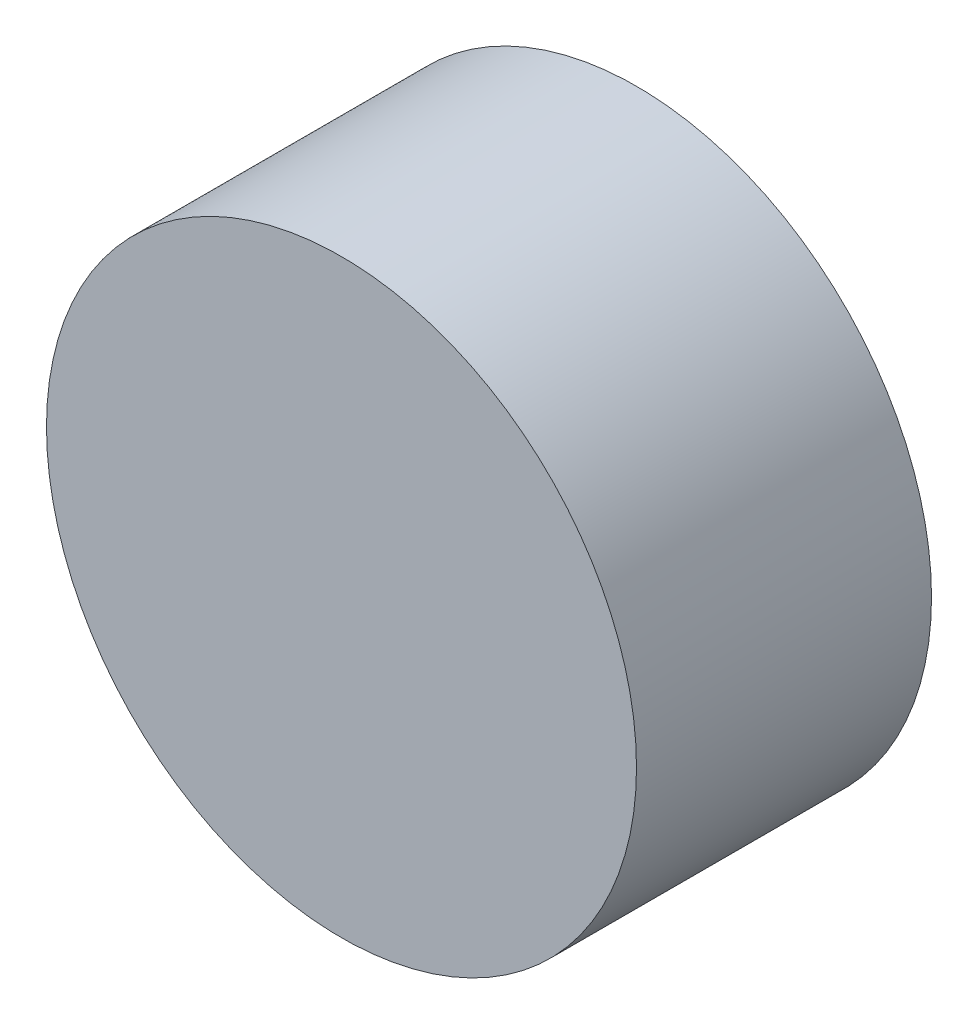
ISO-10303-21;
HEADER;
FILE_DESCRIPTION(('STEP AP214'),'2;1');
FILE_NAME('part.step','',(''),(''),'','','');
FILE_SCHEMA(('AUTOMOTIVE_DESIGN { 1 0 10303 214 1 1 1 1 }'));
ENDSEC;
DATA;
#1=APPLICATION_CONTEXT('core data for automotive mechanical design processes');
#2=APPLICATION_PROTOCOL_DEFINITION('international standard','automotive_design',2000,#1);
#3=PRODUCT_CONTEXT('',#1,'mechanical');
#4=PRODUCT('Part','Part','',(#3));
#5=PRODUCT_RELATED_PRODUCT_CATEGORY('part','',(#4));
#6=PRODUCT_DEFINITION_FORMATION('','',#4);
#7=PRODUCT_DEFINITION_CONTEXT('part definition',#1,'design');
#8=PRODUCT_DEFINITION('design','',#6,#7);
#9=PRODUCT_DEFINITION_SHAPE('','',#8);
#10=(LENGTH_UNIT() NAMED_UNIT(*) SI_UNIT(.MILLI.,.METRE.));
#11=(NAMED_UNIT(*) PLANE_ANGLE_UNIT() SI_UNIT($,.RADIAN.));
#12=(NAMED_UNIT(*) SI_UNIT($,.STERADIAN.) SOLID_ANGLE_UNIT());
#13=UNCERTAINTY_MEASURE_WITH_UNIT(LENGTH_MEASURE(1.E-05),#10,'distance_accuracy_value','');
#14=(GEOMETRIC_REPRESENTATION_CONTEXT(3) GLOBAL_UNCERTAINTY_ASSIGNED_CONTEXT((#13)) GLOBAL_UNIT_ASSIGNED_CONTEXT((#10,
#11,#12)) REPRESENTATION_CONTEXT('',''));
#15=CARTESIAN_POINT('',(0.,0.,0.));
#16=DIRECTION('',(0.,0.,1.));
#17=DIRECTION('',(1.,0.,0.));
#18=AXIS2_PLACEMENT_3D('',#15,#16,#17);
#19=CARTESIAN_POINT('',(0.,0.,100.));
#20=DIRECTION('',(0.,0.,-1.));
#21=DIRECTION('',(-1.,0.,0.));
#22=AXIS2_PLACEMENT_3D('',#19,#20,#21);
#23=CYLINDRICAL_SURFACE('',#22,100.);
#24=CARTESIAN_POINT('',(0.,0.,100.));
#25=DIRECTION('',(0.,0.,1.));
#26=DIRECTION('',(1.,0.,0.));
#27=AXIS2_PLACEMENT_3D('',#24,#25,#26);
#28=CIRCLE('',#27,100.);
#29=CARTESIAN_POINT('',(100.,0.,100.));
#30=VERTEX_POINT('',#29);
#31=EDGE_CURVE('E108',#30,#30,#28,.T.);
#32=ORIENTED_EDGE('',*,*,#31,.F.);
#33=EDGE_LOOP('',(#32));
#34=FACE_BOUND('',#33,.T.);
#35=CARTESIAN_POINT('',(0.,0.,0.));
#36=DIRECTION('',(0.,0.,1.));
#37=DIRECTION('',(1.,0.,0.));
#38=AXIS2_PLACEMENT_3D('',#35,#36,#37);
#39=CIRCLE('',#38,100.);
#40=CARTESIAN_POINT('',(100.,0.,0.));
#41=VERTEX_POINT('',#40);
#42=EDGE_CURVE('E104',#41,#41,#39,.T.);
#43=ORIENTED_EDGE('',*,*,#42,.T.);
#44=EDGE_LOOP('',(#43));
#45=FACE_BOUND('',#44,.T.);
#46=ADVANCED_FACE('F36',(#34,#45),#23,.T.);
#47=CARTESIAN_POINT('',(0.,0.,100.));
#48=DIRECTION('',(0.,0.,1.));
#49=DIRECTION('',(1.,0.,0.));
#50=AXIS2_PLACEMENT_3D('',#47,#48,#49);
#51=PLANE('',#50);
#52=ORIENTED_EDGE('',*,*,#31,.T.);
#53=EDGE_LOOP('',(#52));
#54=FACE_BOUND('',#53,.T.);
#55=ADVANCED_FACE('F136',(#54),#51,.T.);
#56=CARTESIAN_POINT('',(0.,0.,0.));
#57=DIRECTION('',(0.,0.,1.));
#58=DIRECTION('',(1.,0.,0.));
#59=AXIS2_PLACEMENT_3D('',#56,#57,#58);
#60=PLANE('',#59);
#61=DIRECTION('',(-1.,0.,0.));
#62=VECTOR('',#61,1.);
#63=CARTESIAN_POINT('',(0.,5.,0.));
#64=LINE('',#63,#62);
#65=CARTESIAN_POINT('',(12.5,5.,0.));
#66=VERTEX_POINT('',#65);
#67=CARTESIAN_POINT('',(-12.5,5.,0.));
#68=VERTEX_POINT('',#67);
#69=EDGE_CURVE('E111',#66,#68,#64,.T.);
#70=ORIENTED_EDGE('',*,*,#69,.T.);
#71=DIRECTION('',(0.,-1.,0.));
#72=VECTOR('',#71,1.);
#73=CARTESIAN_POINT('',(-12.5,0.,0.));
#74=LINE('',#73,#72);
#75=CARTESIAN_POINT('',(-12.5,-5.,0.));
#76=VERTEX_POINT('',#75);
#77=EDGE_CURVE('E11',#68,#76,#74,.T.);
#78=ORIENTED_EDGE('',*,*,#77,.T.);
#79=DIRECTION('',(1.,0.,0.));
#80=VECTOR('',#79,1.);
#81=CARTESIAN_POINT('',(0.,-5.,0.));
#82=LINE('',#81,#80);
#83=CARTESIAN_POINT('',(12.5,-5.,0.));
#84=VERTEX_POINT('',#83);
#85=EDGE_CURVE('E44',#76,#84,#82,.T.);
#86=ORIENTED_EDGE('',*,*,#85,.T.);
#87=DIRECTION('',(0.,1.,0.));
#88=VECTOR('',#87,1.);
#89=CARTESIAN_POINT('',(12.5,0.,0.));
#90=LINE('',#89,#88);
#91=EDGE_CURVE('E115',#84,#66,#90,.T.);
#92=ORIENTED_EDGE('',*,*,#91,.T.);
#93=EDGE_LOOP('',(#70,#78,#86,#92));
#94=FACE_BOUND('',#93,.T.);
#95=ORIENTED_EDGE('',*,*,#42,.F.);
#96=EDGE_LOOP('',(#95));
#97=FACE_BOUND('',#96,.T.);
#98=ADVANCED_FACE('F119',(#94,#97),#60,.F.);
#99=CARTESIAN_POINT('',(-12.5,-5.,20.));
#100=DIRECTION('',(-1.,0.,0.));
#101=DIRECTION('',(0.,0.,1.));
#102=AXIS2_PLACEMENT_3D('',#99,#100,#101);
#103=PLANE('',#102);
#104=ORIENTED_EDGE('',*,*,#77,.F.);
#105=DIRECTION('',(0.,0.,-1.));
#106=VECTOR('',#105,1.);
#107=CARTESIAN_POINT('',(-12.5,5.,20.));
#108=LINE('',#107,#106);
#109=CARTESIAN_POINT('',(-12.5,5.,-20.));
#110=VERTEX_POINT('',#109);
#111=EDGE_CURVE('E51',#68,#110,#108,.T.);
#112=ORIENTED_EDGE('',*,*,#111,.T.);
#113=DIRECTION('',(0.,1.,0.));
#114=VECTOR('',#113,1.);
#115=CARTESIAN_POINT('',(-12.5,-5.,-20.));
#116=LINE('',#115,#114);
#117=CARTESIAN_POINT('',(-12.5,-5.,-20.));
#118=VERTEX_POINT('',#117);
#119=EDGE_CURVE('E78',#118,#110,#116,.T.);
#120=ORIENTED_EDGE('',*,*,#119,.F.);
#121=DIRECTION('',(0.,0.,-1.));
#122=VECTOR('',#121,1.);
#123=CARTESIAN_POINT('',(-12.5,-5.,20.));
#124=LINE('',#123,#122);
#125=EDGE_CURVE('E102',#76,#118,#124,.T.);
#126=ORIENTED_EDGE('',*,*,#125,.F.);
#127=EDGE_LOOP('',(#104,#112,#120,#126));
#128=FACE_BOUND('',#127,.T.);
#129=ADVANCED_FACE('F76',(#128),#103,.T.);
#130=CARTESIAN_POINT('',(12.5,-5.,20.));
#131=DIRECTION('',(0.,-1.,0.));
#132=DIRECTION('',(0.,0.,-1.));
#133=AXIS2_PLACEMENT_3D('',#130,#131,#132);
#134=PLANE('',#133);
#135=CARTESIAN_POINT('',(0.,-5.,-10.));
#136=DIRECTION('',(0.,-1.,0.));
#137=DIRECTION('',(0.,0.,-1.));
#138=AXIS2_PLACEMENT_3D('',#135,#136,#137);
#139=CIRCLE('',#138,5.);
#140=CARTESIAN_POINT('',(0.,-5.,-15.));
#141=VERTEX_POINT('',#140);
#142=EDGE_CURVE('E97',#141,#141,#139,.T.);
#143=ORIENTED_EDGE('',*,*,#142,.F.);
#144=EDGE_LOOP('',(#143));
#145=FACE_BOUND('',#144,.T.);
#146=ORIENTED_EDGE('',*,*,#85,.F.);
#147=ORIENTED_EDGE('',*,*,#125,.T.);
#148=DIRECTION('',(-1.,0.,0.));
#149=VECTOR('',#148,1.);
#150=CARTESIAN_POINT('',(12.5,-5.,-20.));
#151=LINE('',#150,#149);
#152=CARTESIAN_POINT('',(12.5,-5.,-20.));
#153=VERTEX_POINT('',#152);
#154=EDGE_CURVE('E81',#153,#118,#151,.T.);
#155=ORIENTED_EDGE('',*,*,#154,.F.);
#156=DIRECTION('',(0.,0.,-1.));
#157=VECTOR('',#156,1.);
#158=CARTESIAN_POINT('',(12.5,-5.,20.));
#159=LINE('',#158,#157);
#160=EDGE_CURVE('E105',#84,#153,#159,.T.);
#161=ORIENTED_EDGE('',*,*,#160,.F.);
#162=EDGE_LOOP('',(#146,#147,#155,#161));
#163=FACE_BOUND('',#162,.T.);
#164=ADVANCED_FACE('F123',(#145,#163),#134,.T.);
#165=CARTESIAN_POINT('',(12.5,-5.,20.));
#166=DIRECTION('',(1.,0.,0.));
#167=DIRECTION('',(0.,0.,-1.));
#168=AXIS2_PLACEMENT_3D('',#165,#166,#167);
#169=PLANE('',#168);
#170=ORIENTED_EDGE('',*,*,#91,.F.);
#171=ORIENTED_EDGE('',*,*,#160,.T.);
#172=DIRECTION('',(0.,-1.,0.));
#173=VECTOR('',#172,1.);
#174=CARTESIAN_POINT('',(12.5,-5.,-20.));
#175=LINE('',#174,#173);
#176=CARTESIAN_POINT('',(12.5,5.,-20.));
#177=VERTEX_POINT('',#176);
#178=EDGE_CURVE('E90',#177,#153,#175,.T.);
#179=ORIENTED_EDGE('',*,*,#178,.F.);
#180=DIRECTION('',(0.,0.,-1.));
#181=VECTOR('',#180,1.);
#182=CARTESIAN_POINT('',(12.5,5.,20.));
#183=LINE('',#182,#181);
#184=EDGE_CURVE('E80',#66,#177,#183,.T.);
#185=ORIENTED_EDGE('',*,*,#184,.F.);
#186=EDGE_LOOP('',(#170,#171,#179,#185));
#187=FACE_BOUND('',#186,.T.);
#188=ADVANCED_FACE('F122',(#187),#169,.T.);
#189=CARTESIAN_POINT('',(12.5,5.,20.));
#190=DIRECTION('',(0.,1.,0.));
#191=DIRECTION('',(0.,0.,1.));
#192=AXIS2_PLACEMENT_3D('',#189,#190,#191);
#193=PLANE('',#192);
#194=CARTESIAN_POINT('',(0.,5.,-10.));
#195=DIRECTION('',(0.,1.,0.));
#196=DIRECTION('',(0.,0.,1.));
#197=AXIS2_PLACEMENT_3D('',#194,#195,#196);
#198=CIRCLE('',#197,5.);
#199=CARTESIAN_POINT('',(0.,5.,-5.));
#200=VERTEX_POINT('',#199);
#201=EDGE_CURVE('E39',#200,#200,#198,.T.);
#202=ORIENTED_EDGE('',*,*,#201,.F.);
#203=EDGE_LOOP('',(#202));
#204=FACE_BOUND('',#203,.T.);
#205=ORIENTED_EDGE('',*,*,#69,.F.);
#206=ORIENTED_EDGE('',*,*,#184,.T.);
#207=DIRECTION('',(1.,0.,0.));
#208=VECTOR('',#207,1.);
#209=CARTESIAN_POINT('',(12.5,5.,-20.));
#210=LINE('',#209,#208);
#211=EDGE_CURVE('E84',#110,#177,#210,.T.);
#212=ORIENTED_EDGE('',*,*,#211,.F.);
#213=ORIENTED_EDGE('',*,*,#111,.F.);
#214=EDGE_LOOP('',(#205,#206,#212,#213));
#215=FACE_BOUND('',#214,.T.);
#216=ADVANCED_FACE('F85',(#204,#215),#193,.T.);
#217=CARTESIAN_POINT('',(0.,0.,-20.));
#218=DIRECTION('',(0.,0.,1.));
#219=DIRECTION('',(1.,0.,0.));
#220=AXIS2_PLACEMENT_3D('',#217,#218,#219);
#221=PLANE('',#220);
#222=ORIENTED_EDGE('',*,*,#119,.T.);
#223=ORIENTED_EDGE('',*,*,#211,.T.);
#224=ORIENTED_EDGE('',*,*,#178,.T.);
#225=ORIENTED_EDGE('',*,*,#154,.T.);
#226=EDGE_LOOP('',(#222,#223,#224,#225));
#227=FACE_BOUND('',#226,.T.);
#228=ADVANCED_FACE('F93',(#227),#221,.F.);
#229=CARTESIAN_POINT('',(0.,15.,-10.));
#230=DIRECTION('',(0.,-1.,0.));
#231=DIRECTION('',(0.,0.,-1.));
#232=AXIS2_PLACEMENT_3D('',#229,#230,#231);
#233=CYLINDRICAL_SURFACE('',#232,5.);
#234=ORIENTED_EDGE('',*,*,#201,.T.);
#235=EDGE_LOOP('',(#234));
#236=FACE_BOUND('',#235,.T.);
#237=ORIENTED_EDGE('',*,*,#142,.T.);
#238=EDGE_LOOP('',(#237));
#239=FACE_BOUND('',#238,.T.);
#240=ADVANCED_FACE('F155',(#236,#239),#233,.F.);
#241=CLOSED_SHELL('',(#46,#55,#98,#129,#164,#188,#216,#228,#240));
#242=MANIFOLD_SOLID_BREP('B2',#241);
#243=ADVANCED_BREP_SHAPE_REPRESENTATION('',(#18,#242),#14);
#244=SHAPE_DEFINITION_REPRESENTATION(#9,#243);
ENDSEC;
END-ISO-10303-21;
